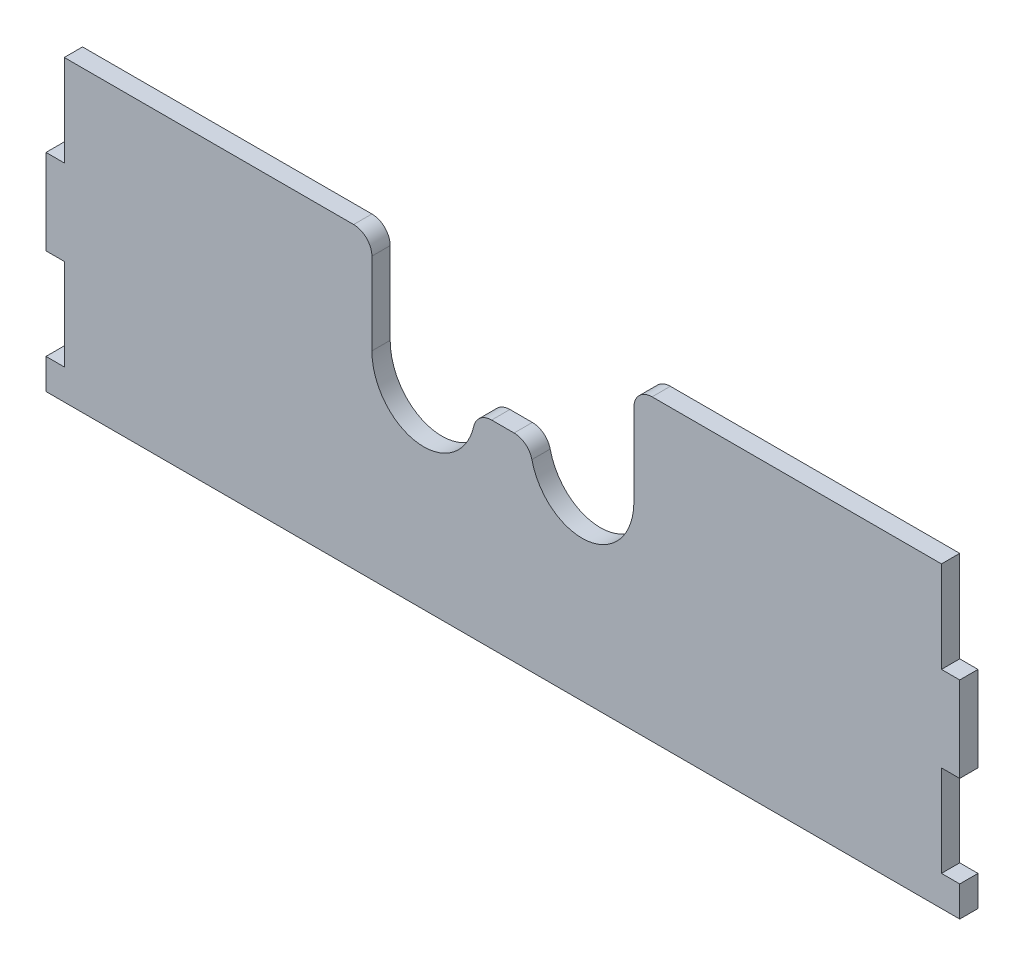
ISO-10303-21;
HEADER;
FILE_DESCRIPTION(('STEP AP214'),'2;1');
FILE_NAME('part.step','',(''),(''),'','','');
FILE_SCHEMA(('AUTOMOTIVE_DESIGN { 1 0 10303 214 1 1 1 1 }'));
ENDSEC;
DATA;
#1=APPLICATION_CONTEXT('core data for automotive mechanical design processes');
#2=APPLICATION_PROTOCOL_DEFINITION('international standard','automotive_design',2000,#1);
#3=PRODUCT_CONTEXT('',#1,'mechanical');
#4=PRODUCT('Part','Part','',(#3));
#5=PRODUCT_RELATED_PRODUCT_CATEGORY('part','',(#4));
#6=PRODUCT_DEFINITION_FORMATION('','',#4);
#7=PRODUCT_DEFINITION_CONTEXT('part definition',#1,'design');
#8=PRODUCT_DEFINITION('design','',#6,#7);
#9=PRODUCT_DEFINITION_SHAPE('','',#8);
#10=(LENGTH_UNIT() NAMED_UNIT(*) SI_UNIT(.MILLI.,.METRE.));
#11=(NAMED_UNIT(*) PLANE_ANGLE_UNIT() SI_UNIT($,.RADIAN.));
#12=(NAMED_UNIT(*) SI_UNIT($,.STERADIAN.) SOLID_ANGLE_UNIT());
#13=UNCERTAINTY_MEASURE_WITH_UNIT(LENGTH_MEASURE(1.E-05),#10,'distance_accuracy_value','');
#14=(GEOMETRIC_REPRESENTATION_CONTEXT(3) GLOBAL_UNCERTAINTY_ASSIGNED_CONTEXT((#13)) GLOBAL_UNIT_ASSIGNED_CONTEXT((#10,
#11,#12)) REPRESENTATION_CONTEXT('',''));
#15=CARTESIAN_POINT('',(0.,0.,0.));
#16=DIRECTION('',(0.,0.,1.));
#17=DIRECTION('',(1.,0.,0.));
#18=AXIS2_PLACEMENT_3D('',#15,#16,#17);
#19=CARTESIAN_POINT('',(0.,0.,3.));
#20=DIRECTION('',(0.,0.,1.));
#21=DIRECTION('',(1.,0.,0.));
#22=AXIS2_PLACEMENT_3D('',#19,#20,#21);
#23=PLANE('',#22);
#24=DIRECTION('',(0.,1.,0.));
#25=VECTOR('',#24,1.);
#26=CARTESIAN_POINT('',(-75.,0.,3.));
#27=LINE('',#26,#25);
#28=CARTESIAN_POINT('',(-75.,-24.,3.));
#29=VERTEX_POINT('',#28);
#30=CARTESIAN_POINT('',(-75.,-19.,3.));
#31=VERTEX_POINT('',#30);
#32=EDGE_CURVE('E227',#29,#31,#27,.T.);
#33=ORIENTED_EDGE('',*,*,#32,.F.);
#34=DIRECTION('',(-1.,0.,0.));
#35=VECTOR('',#34,1.);
#36=CARTESIAN_POINT('',(-75.,-24.,3.));
#37=LINE('',#36,#35);
#38=CARTESIAN_POINT('',(75.,-24.,3.));
#39=VERTEX_POINT('',#38);
#40=EDGE_CURVE('E56',#39,#29,#37,.T.);
#41=ORIENTED_EDGE('',*,*,#40,.F.);
#42=DIRECTION('',(0.,1.,0.));
#43=VECTOR('',#42,1.);
#44=CARTESIAN_POINT('',(75.,0.,3.));
#45=LINE('',#44,#43);
#46=CARTESIAN_POINT('',(75.,-19.,3.));
#47=VERTEX_POINT('',#46);
#48=EDGE_CURVE('E224',#39,#47,#45,.T.);
#49=ORIENTED_EDGE('',*,*,#48,.T.);
#50=DIRECTION('',(-1.,0.,0.));
#51=VECTOR('',#50,1.);
#52=CARTESIAN_POINT('',(0.,-19.,3.));
#53=LINE('',#52,#51);
#54=CARTESIAN_POINT('',(72.,-19.,3.));
#55=VERTEX_POINT('',#54);
#56=EDGE_CURVE('E233',#47,#55,#53,.T.);
#57=ORIENTED_EDGE('',*,*,#56,.T.);
#58=DIRECTION('',(0.,1.,0.));
#59=VECTOR('',#58,1.);
#60=CARTESIAN_POINT('',(72.,0.,3.));
#61=LINE('',#60,#59);
#62=CARTESIAN_POINT('',(72.,-4.,3.));
#63=VERTEX_POINT('',#62);
#64=EDGE_CURVE('E237',#55,#63,#61,.T.);
#65=ORIENTED_EDGE('',*,*,#64,.T.);
#66=DIRECTION('',(-1.,0.,0.));
#67=VECTOR('',#66,1.);
#68=CARTESIAN_POINT('',(0.,-3.99999999999996,3.));
#69=LINE('',#68,#67);
#70=CARTESIAN_POINT('',(75.,-4.,3.));
#71=VERTEX_POINT('',#70);
#72=EDGE_CURVE('E244',#71,#63,#69,.T.);
#73=ORIENTED_EDGE('',*,*,#72,.F.);
#74=CARTESIAN_POINT('',(75.,10.,3.));
#75=VERTEX_POINT('',#74);
#76=EDGE_CURVE('E236',#71,#75,#45,.T.);
#77=ORIENTED_EDGE('',*,*,#76,.T.);
#78=DIRECTION('',(-1.,0.,0.));
#79=VECTOR('',#78,1.);
#80=CARTESIAN_POINT('',(0.,10.,3.));
#81=LINE('',#80,#79);
#82=CARTESIAN_POINT('',(72.,10.,3.));
#83=VERTEX_POINT('',#82);
#84=EDGE_CURVE('E243',#75,#83,#81,.T.);
#85=ORIENTED_EDGE('',*,*,#84,.T.);
#86=DIRECTION('',(0.,1.,0.));
#87=VECTOR('',#86,1.);
#88=CARTESIAN_POINT('',(72.,0.,3.));
#89=LINE('',#88,#87);
#90=CARTESIAN_POINT('',(72.,25.,3.));
#91=VERTEX_POINT('',#90);
#92=EDGE_CURVE('E248',#83,#91,#89,.T.);
#93=ORIENTED_EDGE('',*,*,#92,.T.);
#94=DIRECTION('',(1.,0.,0.));
#95=VECTOR('',#94,1.);
#96=CARTESIAN_POINT('',(0.,25.,3.));
#97=LINE('',#96,#95);
#98=CARTESIAN_POINT('',(24.5,25.,3.));
#99=VERTEX_POINT('',#98);
#100=EDGE_CURVE('E257',#99,#91,#97,.T.);
#101=ORIENTED_EDGE('',*,*,#100,.F.);
#102=CARTESIAN_POINT('',(24.5,22.,3.));
#103=DIRECTION('',(0.,0.,1.));
#104=DIRECTION('',(1.,0.,0.));
#105=AXIS2_PLACEMENT_3D('',#102,#103,#104);
#106=CIRCLE('',#105,3.);
#107=CARTESIAN_POINT('',(21.5,22.,3.));
#108=VERTEX_POINT('',#107);
#109=EDGE_CURVE('E364',#99,#108,#106,.T.);
#110=ORIENTED_EDGE('',*,*,#109,.T.);
#111=DIRECTION('',(0.,1.,0.));
#112=VECTOR('',#111,1.);
#113=CARTESIAN_POINT('',(21.5,25.,3.));
#114=LINE('',#113,#112);
#115=CARTESIAN_POINT('',(21.5,8.53147829619743,3.));
#116=VERTEX_POINT('',#115);
#117=EDGE_CURVE('E400',#116,#108,#114,.T.);
#118=ORIENTED_EDGE('',*,*,#117,.F.);
#119=CARTESIAN_POINT('',(13.,8.53147829619743,3.));
#120=DIRECTION('',(0.,0.,1.));
#121=DIRECTION('',(0.,1.,0.));
#122=AXIS2_PLACEMENT_3D('',#119,#120,#121);
#123=ELLIPSE('',#122,9.37871231118118,8.5);
#124=CARTESIAN_POINT('',(4.76483275541187,6.20860689794301,3.));
#125=VERTEX_POINT('',#124);
#126=EDGE_CURVE('E281',#116,#125,#123,.F.);
#127=ORIENTED_EDGE('',*,*,#126,.T.);
#128=CARTESIAN_POINT('',(1.84224882048407,5.53147829619743,3.));
#129=DIRECTION('',(0.,0.,1.));
#130=DIRECTION('',(1.,0.,0.));
#131=AXIS2_PLACEMENT_3D('',#128,#129,#130);
#132=CIRCLE('',#131,3.);
#133=CARTESIAN_POINT('',(1.84224882048407,8.53147829619743,3.));
#134=VERTEX_POINT('',#133);
#135=EDGE_CURVE('E64',#125,#134,#132,.T.);
#136=ORIENTED_EDGE('',*,*,#135,.T.);
#137=DIRECTION('',(1.,0.,0.));
#138=VECTOR('',#137,1.);
#139=CARTESIAN_POINT('',(-21.5,8.53147829619743,3.));
#140=LINE('',#139,#138);
#141=CARTESIAN_POINT('',(-1.84224882048407,8.53147829619743,3.));
#142=VERTEX_POINT('',#141);
#143=EDGE_CURVE('E382',#142,#134,#140,.T.);
#144=ORIENTED_EDGE('',*,*,#143,.F.);
#145=CARTESIAN_POINT('',(-1.84224882048407,5.53147829619744,3.));
#146=DIRECTION('',(0.,0.,1.));
#147=DIRECTION('',(1.,0.,0.));
#148=AXIS2_PLACEMENT_3D('',#145,#146,#147);
#149=CIRCLE('',#148,3.);
#150=CARTESIAN_POINT('',(-4.76483275541187,6.20860689794302,3.));
#151=VERTEX_POINT('',#150);
#152=EDGE_CURVE('E359',#142,#151,#149,.T.);
#153=ORIENTED_EDGE('',*,*,#152,.T.);
#154=CARTESIAN_POINT('',(-13.,8.53147829619743,3.));
#155=DIRECTION('',(0.,0.,1.));
#156=DIRECTION('',(0.,1.,0.));
#157=AXIS2_PLACEMENT_3D('',#154,#155,#156);
#158=ELLIPSE('',#157,9.37871231118118,8.5);
#159=CARTESIAN_POINT('',(-21.5,8.53147829619743,3.));
#160=VERTEX_POINT('',#159);
#161=EDGE_CURVE('E401',#151,#160,#158,.F.);
#162=ORIENTED_EDGE('',*,*,#161,.T.);
#163=DIRECTION('',(0.,-1.,0.));
#164=VECTOR('',#163,1.);
#165=CARTESIAN_POINT('',(-21.5,25.,3.));
#166=LINE('',#165,#164);
#167=CARTESIAN_POINT('',(-21.5,22.,3.));
#168=VERTEX_POINT('',#167);
#169=EDGE_CURVE('E508',#168,#160,#166,.T.);
#170=ORIENTED_EDGE('',*,*,#169,.F.);
#171=CARTESIAN_POINT('',(-24.5,22.,3.));
#172=DIRECTION('',(0.,0.,1.));
#173=DIRECTION('',(1.,0.,0.));
#174=AXIS2_PLACEMENT_3D('',#171,#172,#173);
#175=CIRCLE('',#174,3.);
#176=CARTESIAN_POINT('',(-24.5,25.,3.));
#177=VERTEX_POINT('',#176);
#178=EDGE_CURVE('E362',#168,#177,#175,.T.);
#179=ORIENTED_EDGE('',*,*,#178,.T.);
#180=CARTESIAN_POINT('',(-72.,25.,3.));
#181=VERTEX_POINT('',#180);
#182=EDGE_CURVE('E258',#181,#177,#97,.T.);
#183=ORIENTED_EDGE('',*,*,#182,.F.);
#184=DIRECTION('',(0.,1.,0.));
#185=VECTOR('',#184,1.);
#186=CARTESIAN_POINT('',(-72.,0.,3.));
#187=LINE('',#186,#185);
#188=CARTESIAN_POINT('',(-72.,10.,3.));
#189=VERTEX_POINT('',#188);
#190=EDGE_CURVE('E261',#189,#181,#187,.T.);
#191=ORIENTED_EDGE('',*,*,#190,.F.);
#192=DIRECTION('',(1.,0.,0.));
#193=VECTOR('',#192,1.);
#194=CARTESIAN_POINT('',(0.,10.,3.));
#195=LINE('',#194,#193);
#196=CARTESIAN_POINT('',(-75.,10.,3.));
#197=VERTEX_POINT('',#196);
#198=EDGE_CURVE('E264',#197,#189,#195,.T.);
#199=ORIENTED_EDGE('',*,*,#198,.F.);
#200=CARTESIAN_POINT('',(-75.,-4.,3.));
#201=VERTEX_POINT('',#200);
#202=EDGE_CURVE('E267',#201,#197,#27,.T.);
#203=ORIENTED_EDGE('',*,*,#202,.F.);
#204=DIRECTION('',(1.,0.,0.));
#205=VECTOR('',#204,1.);
#206=CARTESIAN_POINT('',(0.,-3.99999999999996,3.));
#207=LINE('',#206,#205);
#208=CARTESIAN_POINT('',(-72.,-4.,3.));
#209=VERTEX_POINT('',#208);
#210=EDGE_CURVE('E270',#201,#209,#207,.T.);
#211=ORIENTED_EDGE('',*,*,#210,.T.);
#212=DIRECTION('',(0.,1.,0.));
#213=VECTOR('',#212,1.);
#214=CARTESIAN_POINT('',(-72.,0.,3.));
#215=LINE('',#214,#213);
#216=CARTESIAN_POINT('',(-72.,-19.,3.));
#217=VERTEX_POINT('',#216);
#218=EDGE_CURVE('E272',#217,#209,#215,.T.);
#219=ORIENTED_EDGE('',*,*,#218,.F.);
#220=DIRECTION('',(1.,0.,0.));
#221=VECTOR('',#220,1.);
#222=CARTESIAN_POINT('',(0.,-19.,3.));
#223=LINE('',#222,#221);
#224=EDGE_CURVE('E275',#31,#217,#223,.T.);
#225=ORIENTED_EDGE('',*,*,#224,.F.);
#226=EDGE_LOOP('',(#33,#41,#49,#57,#65,#73,#77,#85,#93,#101,#110,#118,#127,#136,#144,#153,#162,
#170,#179,#183,#191,#199,#203,#211,#219,#225));
#227=FACE_BOUND('',#226,.T.);
#228=ADVANCED_FACE('F41',(#227),#23,.T.);
#229=CARTESIAN_POINT('',(0.,0.,0.));
#230=DIRECTION('',(0.,0.,1.));
#231=DIRECTION('',(1.,0.,0.));
#232=AXIS2_PLACEMENT_3D('',#229,#230,#231);
#233=PLANE('',#232);
#234=DIRECTION('',(-1.,0.,0.));
#235=VECTOR('',#234,1.);
#236=CARTESIAN_POINT('',(-75.,-24.,0.));
#237=LINE('',#236,#235);
#238=CARTESIAN_POINT('',(75.,-24.,0.));
#239=VERTEX_POINT('',#238);
#240=CARTESIAN_POINT('',(-75.,-24.,0.));
#241=VERTEX_POINT('',#240);
#242=EDGE_CURVE('E216',#239,#241,#237,.T.);
#243=ORIENTED_EDGE('',*,*,#242,.T.);
#244=DIRECTION('',(0.,1.,0.));
#245=VECTOR('',#244,1.);
#246=CARTESIAN_POINT('',(-75.,0.,0.));
#247=LINE('',#246,#245);
#248=CARTESIAN_POINT('',(-75.,-19.,0.));
#249=VERTEX_POINT('',#248);
#250=EDGE_CURVE('E234',#241,#249,#247,.T.);
#251=ORIENTED_EDGE('',*,*,#250,.T.);
#252=DIRECTION('',(1.,0.,0.));
#253=VECTOR('',#252,1.);
#254=CARTESIAN_POINT('',(0.,-19.,0.));
#255=LINE('',#254,#253);
#256=CARTESIAN_POINT('',(-72.,-19.,0.));
#257=VERTEX_POINT('',#256);
#258=EDGE_CURVE('E239',#249,#257,#255,.T.);
#259=ORIENTED_EDGE('',*,*,#258,.T.);
#260=DIRECTION('',(0.,1.,0.));
#261=VECTOR('',#260,1.);
#262=CARTESIAN_POINT('',(-72.,0.,0.));
#263=LINE('',#262,#261);
#264=CARTESIAN_POINT('',(-72.,-4.,0.));
#265=VERTEX_POINT('',#264);
#266=EDGE_CURVE('E309',#257,#265,#263,.T.);
#267=ORIENTED_EDGE('',*,*,#266,.T.);
#268=DIRECTION('',(1.,0.,0.));
#269=VECTOR('',#268,1.);
#270=CARTESIAN_POINT('',(0.,-3.99999999999996,0.));
#271=LINE('',#270,#269);
#272=CARTESIAN_POINT('',(-75.,-4.,0.));
#273=VERTEX_POINT('',#272);
#274=EDGE_CURVE('E306',#273,#265,#271,.T.);
#275=ORIENTED_EDGE('',*,*,#274,.F.);
#276=CARTESIAN_POINT('',(-75.,10.,0.));
#277=VERTEX_POINT('',#276);
#278=EDGE_CURVE('E241',#273,#277,#247,.T.);
#279=ORIENTED_EDGE('',*,*,#278,.T.);
#280=DIRECTION('',(1.,0.,0.));
#281=VECTOR('',#280,1.);
#282=CARTESIAN_POINT('',(0.,10.,0.));
#283=LINE('',#282,#281);
#284=CARTESIAN_POINT('',(-72.,10.,0.));
#285=VERTEX_POINT('',#284);
#286=EDGE_CURVE('E302',#277,#285,#283,.T.);
#287=ORIENTED_EDGE('',*,*,#286,.T.);
#288=DIRECTION('',(0.,1.,0.));
#289=VECTOR('',#288,1.);
#290=CARTESIAN_POINT('',(-72.,0.,0.));
#291=LINE('',#290,#289);
#292=CARTESIAN_POINT('',(-72.,25.,0.));
#293=VERTEX_POINT('',#292);
#294=EDGE_CURVE('E299',#285,#293,#291,.T.);
#295=ORIENTED_EDGE('',*,*,#294,.T.);
#296=DIRECTION('',(1.,0.,0.));
#297=VECTOR('',#296,1.);
#298=CARTESIAN_POINT('',(0.,25.,0.));
#299=LINE('',#298,#297);
#300=CARTESIAN_POINT('',(-24.5,25.,0.));
#301=VERTEX_POINT('',#300);
#302=EDGE_CURVE('E296',#293,#301,#299,.T.);
#303=ORIENTED_EDGE('',*,*,#302,.T.);
#304=CARTESIAN_POINT('',(-24.5,22.,0.));
#305=DIRECTION('',(0.,0.,1.));
#306=DIRECTION('',(1.,0.,0.));
#307=AXIS2_PLACEMENT_3D('',#304,#305,#306);
#308=CIRCLE('',#307,3.);
#309=CARTESIAN_POINT('',(-21.5,22.,0.));
#310=VERTEX_POINT('',#309);
#311=EDGE_CURVE('E353',#301,#310,#308,.F.);
#312=ORIENTED_EDGE('',*,*,#311,.T.);
#313=DIRECTION('',(0.,-1.,0.));
#314=VECTOR('',#313,1.);
#315=CARTESIAN_POINT('',(-21.5,25.,0.));
#316=LINE('',#315,#314);
#317=CARTESIAN_POINT('',(-21.5,8.53147829619743,0.));
#318=VERTEX_POINT('',#317);
#319=EDGE_CURVE('E220',#310,#318,#316,.T.);
#320=ORIENTED_EDGE('',*,*,#319,.T.);
#321=CARTESIAN_POINT('',(-13.,8.53147829619743,0.));
#322=DIRECTION('',(0.,0.,1.));
#323=DIRECTION('',(0.,1.,0.));
#324=AXIS2_PLACEMENT_3D('',#321,#322,#323);
#325=ELLIPSE('',#324,9.37871231118118,8.5);
#326=CARTESIAN_POINT('',(-4.76483275541187,6.20860689794302,0.));
#327=VERTEX_POINT('',#326);
#328=EDGE_CURVE('E405',#318,#327,#325,.T.);
#329=ORIENTED_EDGE('',*,*,#328,.T.);
#330=CARTESIAN_POINT('',(-1.84224882048407,5.53147829619744,0.));
#331=DIRECTION('',(0.,0.,1.));
#332=DIRECTION('',(1.,0.,0.));
#333=AXIS2_PLACEMENT_3D('',#330,#331,#332);
#334=CIRCLE('',#333,3.);
#335=CARTESIAN_POINT('',(-1.84224882048407,8.53147829619743,0.));
#336=VERTEX_POINT('',#335);
#337=EDGE_CURVE('E349',#327,#336,#334,.F.);
#338=ORIENTED_EDGE('',*,*,#337,.T.);
#339=DIRECTION('',(1.,0.,0.));
#340=VECTOR('',#339,1.);
#341=CARTESIAN_POINT('',(-21.5,8.53147829619743,0.));
#342=LINE('',#341,#340);
#343=CARTESIAN_POINT('',(1.84224882048407,8.53147829619743,0.));
#344=VERTEX_POINT('',#343);
#345=EDGE_CURVE('E380',#336,#344,#342,.T.);
#346=ORIENTED_EDGE('',*,*,#345,.T.);
#347=CARTESIAN_POINT('',(1.84224882048407,5.53147829619743,0.));
#348=DIRECTION('',(0.,0.,1.));
#349=DIRECTION('',(1.,0.,0.));
#350=AXIS2_PLACEMENT_3D('',#347,#348,#349);
#351=CIRCLE('',#350,3.);
#352=CARTESIAN_POINT('',(4.76483275541187,6.20860689794301,0.));
#353=VERTEX_POINT('',#352);
#354=EDGE_CURVE('E351',#344,#353,#351,.F.);
#355=ORIENTED_EDGE('',*,*,#354,.T.);
#356=CARTESIAN_POINT('',(13.,8.53147829619743,0.));
#357=DIRECTION('',(0.,0.,1.));
#358=DIRECTION('',(0.,1.,0.));
#359=AXIS2_PLACEMENT_3D('',#356,#357,#358);
#360=ELLIPSE('',#359,9.37871231118118,8.5);
#361=CARTESIAN_POINT('',(21.5,8.53147829619743,0.));
#362=VERTEX_POINT('',#361);
#363=EDGE_CURVE('E397',#353,#362,#360,.T.);
#364=ORIENTED_EDGE('',*,*,#363,.T.);
#365=DIRECTION('',(0.,1.,0.));
#366=VECTOR('',#365,1.);
#367=CARTESIAN_POINT('',(21.5,25.,0.));
#368=LINE('',#367,#366);
#369=CARTESIAN_POINT('',(21.5,22.,0.));
#370=VERTEX_POINT('',#369);
#371=EDGE_CURVE('E389',#362,#370,#368,.T.);
#372=ORIENTED_EDGE('',*,*,#371,.T.);
#373=CARTESIAN_POINT('',(24.5,22.,0.));
#374=DIRECTION('',(0.,0.,1.));
#375=DIRECTION('',(1.,0.,0.));
#376=AXIS2_PLACEMENT_3D('',#373,#374,#375);
#377=CIRCLE('',#376,3.);
#378=CARTESIAN_POINT('',(24.5,25.,0.));
#379=VERTEX_POINT('',#378);
#380=EDGE_CURVE('E355',#370,#379,#377,.F.);
#381=ORIENTED_EDGE('',*,*,#380,.T.);
#382=CARTESIAN_POINT('',(72.,25.,0.));
#383=VERTEX_POINT('',#382);
#384=EDGE_CURVE('E295',#379,#383,#299,.T.);
#385=ORIENTED_EDGE('',*,*,#384,.T.);
#386=DIRECTION('',(0.,1.,0.));
#387=VECTOR('',#386,1.);
#388=CARTESIAN_POINT('',(72.,0.,0.));
#389=LINE('',#388,#387);
#390=CARTESIAN_POINT('',(72.,10.,0.));
#391=VERTEX_POINT('',#390);
#392=EDGE_CURVE('E292',#391,#383,#389,.T.);
#393=ORIENTED_EDGE('',*,*,#392,.F.);
#394=DIRECTION('',(-1.,0.,0.));
#395=VECTOR('',#394,1.);
#396=CARTESIAN_POINT('',(0.,10.,0.));
#397=LINE('',#396,#395);
#398=CARTESIAN_POINT('',(75.,10.,0.));
#399=VERTEX_POINT('',#398);
#400=EDGE_CURVE('E290',#399,#391,#397,.T.);
#401=ORIENTED_EDGE('',*,*,#400,.F.);
#402=DIRECTION('',(0.,1.,0.));
#403=VECTOR('',#402,1.);
#404=CARTESIAN_POINT('',(75.,0.,0.));
#405=LINE('',#404,#403);
#406=CARTESIAN_POINT('',(75.,-4.,0.));
#407=VERTEX_POINT('',#406);
#408=EDGE_CURVE('E282',#407,#399,#405,.T.);
#409=ORIENTED_EDGE('',*,*,#408,.F.);
#410=DIRECTION('',(-1.,0.,0.));
#411=VECTOR('',#410,1.);
#412=CARTESIAN_POINT('',(0.,-3.99999999999996,0.));
#413=LINE('',#412,#411);
#414=CARTESIAN_POINT('',(72.,-4.,0.));
#415=VERTEX_POINT('',#414);
#416=EDGE_CURVE('E287',#407,#415,#413,.T.);
#417=ORIENTED_EDGE('',*,*,#416,.T.);
#418=DIRECTION('',(0.,1.,0.));
#419=VECTOR('',#418,1.);
#420=CARTESIAN_POINT('',(72.,0.,0.));
#421=LINE('',#420,#419);
#422=CARTESIAN_POINT('',(72.,-19.,0.));
#423=VERTEX_POINT('',#422);
#424=EDGE_CURVE('E284',#423,#415,#421,.T.);
#425=ORIENTED_EDGE('',*,*,#424,.F.);
#426=DIRECTION('',(-1.,0.,0.));
#427=VECTOR('',#426,1.);
#428=CARTESIAN_POINT('',(0.,-19.,0.));
#429=LINE('',#428,#427);
#430=CARTESIAN_POINT('',(75.,-19.,0.));
#431=VERTEX_POINT('',#430);
#432=EDGE_CURVE('E280',#431,#423,#429,.T.);
#433=ORIENTED_EDGE('',*,*,#432,.F.);
#434=EDGE_CURVE('E278',#239,#431,#405,.T.);
#435=ORIENTED_EDGE('',*,*,#434,.F.);
#436=EDGE_LOOP('',(#243,#251,#259,#267,#275,#279,#287,#295,#303,#312,#320,#329,#338,#346,#355,
#364,#372,#381,#385,#393,#401,#409,#417,#425,#433,#435));
#437=FACE_BOUND('',#436,.T.);
#438=ADVANCED_FACE('F386',(#437),#233,.F.);
#439=CARTESIAN_POINT('',(75.,0.,3.));
#440=DIRECTION('',(-1.,0.,0.));
#441=DIRECTION('',(0.,0.,1.));
#442=AXIS2_PLACEMENT_3D('',#439,#440,#441);
#443=PLANE('',#442);
#444=DIRECTION('',(0.,0.,-1.));
#445=VECTOR('',#444,1.);
#446=CARTESIAN_POINT('',(75.,-24.,3.));
#447=LINE('',#446,#445);
#448=EDGE_CURVE('E213',#39,#239,#447,.T.);
#449=ORIENTED_EDGE('',*,*,#448,.T.);
#450=ORIENTED_EDGE('',*,*,#434,.T.);
#451=DIRECTION('',(0.,0.,-1.));
#452=VECTOR('',#451,1.);
#453=CARTESIAN_POINT('',(75.,-19.,3.));
#454=LINE('',#453,#452);
#455=EDGE_CURVE('E232',#47,#431,#454,.T.);
#456=ORIENTED_EDGE('',*,*,#455,.F.);
#457=ORIENTED_EDGE('',*,*,#48,.F.);
#458=EDGE_LOOP('',(#449,#450,#456,#457));
#459=FACE_BOUND('',#458,.T.);
#460=ADVANCED_FACE('F230',(#459),#443,.F.);
#461=CARTESIAN_POINT('',(-75.,0.,3.));
#462=DIRECTION('',(-1.,0.,0.));
#463=DIRECTION('',(0.,0.,1.));
#464=AXIS2_PLACEMENT_3D('',#461,#462,#463);
#465=PLANE('',#464);
#466=ORIENTED_EDGE('',*,*,#250,.F.);
#467=DIRECTION('',(0.,0.,-1.));
#468=VECTOR('',#467,1.);
#469=CARTESIAN_POINT('',(-75.,-24.,3.));
#470=LINE('',#469,#468);
#471=EDGE_CURVE('E221',#29,#241,#470,.T.);
#472=ORIENTED_EDGE('',*,*,#471,.F.);
#473=ORIENTED_EDGE('',*,*,#32,.T.);
#474=DIRECTION('',(0.,0.,-1.));
#475=VECTOR('',#474,1.);
#476=CARTESIAN_POINT('',(-75.,-19.,3.));
#477=LINE('',#476,#475);
#478=EDGE_CURVE('E314',#31,#249,#477,.T.);
#479=ORIENTED_EDGE('',*,*,#478,.T.);
#480=EDGE_LOOP('',(#466,#472,#473,#479));
#481=FACE_BOUND('',#480,.T.);
#482=ADVANCED_FACE('F423',(#481),#465,.T.);
#483=CARTESIAN_POINT('',(0.,25.,3.));
#484=DIRECTION('',(0.,1.,0.));
#485=DIRECTION('',(0.,0.,1.));
#486=AXIS2_PLACEMENT_3D('',#483,#484,#485);
#487=PLANE('',#486);
#488=ORIENTED_EDGE('',*,*,#182,.T.);
#489=DIRECTION('',(0.,0.,-1.));
#490=VECTOR('',#489,1.);
#491=CARTESIAN_POINT('',(-24.5,25.,3.));
#492=LINE('',#491,#490);
#493=EDGE_CURVE('E366',#177,#301,#492,.T.);
#494=ORIENTED_EDGE('',*,*,#493,.T.);
#495=ORIENTED_EDGE('',*,*,#302,.F.);
#496=DIRECTION('',(0.,0.,-1.));
#497=VECTOR('',#496,1.);
#498=CARTESIAN_POINT('',(-72.,25.,3.));
#499=LINE('',#498,#497);
#500=EDGE_CURVE('E327',#181,#293,#499,.T.);
#501=ORIENTED_EDGE('',*,*,#500,.F.);
#502=EDGE_LOOP('',(#488,#494,#495,#501));
#503=FACE_BOUND('',#502,.T.);
#504=ADVANCED_FACE('F426',(#503),#487,.T.);
#505=ORIENTED_EDGE('',*,*,#384,.F.);
#506=DIRECTION('',(0.,0.,-1.));
#507=VECTOR('',#506,1.);
#508=CARTESIAN_POINT('',(24.5,25.,3.));
#509=LINE('',#508,#507);
#510=EDGE_CURVE('E357',#379,#99,#509,.F.);
#511=ORIENTED_EDGE('',*,*,#510,.T.);
#512=ORIENTED_EDGE('',*,*,#100,.T.);
#513=DIRECTION('',(0.,0.,-1.));
#514=VECTOR('',#513,1.);
#515=CARTESIAN_POINT('',(72.,25.,3.));
#516=LINE('',#515,#514);
#517=EDGE_CURVE('E329',#91,#383,#516,.T.);
#518=ORIENTED_EDGE('',*,*,#517,.T.);
#519=EDGE_LOOP('',(#505,#511,#512,#518));
#520=FACE_BOUND('',#519,.T.);
#521=ADVANCED_FACE('F452',(#520),#487,.T.);
#522=CARTESIAN_POINT('',(13.,8.53147829619743,3.));
#523=DIRECTION('',(0.,0.,1.));
#524=DIRECTION('',(0.,1.,0.));
#525=AXIS2_PLACEMENT_3D('',#522,#523,#524);
#526=ELLIPSE('',#525,9.37871231118118,8.5);
#527=DIRECTION('',(0.,0.,-1.));
#528=VECTOR('',#527,1.);
#529=SURFACE_OF_LINEAR_EXTRUSION('',#526,#528);
#530=ORIENTED_EDGE('',*,*,#363,.F.);
#531=DIRECTION('',(0.,0.,-1.));
#532=VECTOR('',#531,1.);
#533=CARTESIAN_POINT('',(4.76483275541187,6.20860689794301,0.));
#534=LINE('',#533,#532);
#535=EDGE_CURVE('E371',#353,#125,#534,.F.);
#536=ORIENTED_EDGE('',*,*,#535,.T.);
#537=ORIENTED_EDGE('',*,*,#126,.F.);
#538=DIRECTION('',(0.,0.,-1.));
#539=VECTOR('',#538,1.);
#540=CARTESIAN_POINT('',(21.5,8.53147829619743,3.));
#541=LINE('',#540,#539);
#542=EDGE_CURVE('E502',#116,#362,#541,.T.);
#543=ORIENTED_EDGE('',*,*,#542,.T.);
#544=EDGE_LOOP('',(#530,#536,#537,#543));
#545=FACE_BOUND('',#544,.T.);
#546=ADVANCED_FACE('F395',(#545),#529,.T.);
#547=CARTESIAN_POINT('',(-13.,8.53147829619743,3.));
#548=DIRECTION('',(0.,0.,1.));
#549=DIRECTION('',(0.,1.,0.));
#550=AXIS2_PLACEMENT_3D('',#547,#548,#549);
#551=ELLIPSE('',#550,9.37871231118118,8.5);
#552=DIRECTION('',(0.,0.,-1.));
#553=VECTOR('',#552,1.);
#554=SURFACE_OF_LINEAR_EXTRUSION('',#551,#553);
#555=ORIENTED_EDGE('',*,*,#161,.F.);
#556=DIRECTION('',(0.,0.,-1.));
#557=VECTOR('',#556,1.);
#558=CARTESIAN_POINT('',(-4.76483275541187,6.20860689794302,3.));
#559=LINE('',#558,#557);
#560=EDGE_CURVE('E11',#151,#327,#559,.T.);
#561=ORIENTED_EDGE('',*,*,#560,.T.);
#562=ORIENTED_EDGE('',*,*,#328,.F.);
#563=DIRECTION('',(0.,0.,-1.));
#564=VECTOR('',#563,1.);
#565=CARTESIAN_POINT('',(-21.5,8.53147829619743,3.));
#566=LINE('',#565,#564);
#567=EDGE_CURVE('E407',#160,#318,#566,.T.);
#568=ORIENTED_EDGE('',*,*,#567,.F.);
#569=EDGE_LOOP('',(#555,#561,#562,#568));
#570=FACE_BOUND('',#569,.T.);
#571=ADVANCED_FACE('F412',(#570),#554,.T.);
#572=CARTESIAN_POINT('',(0.,-19.,3.));
#573=DIRECTION('',(0.,-1.,0.));
#574=DIRECTION('',(0.,0.,-1.));
#575=AXIS2_PLACEMENT_3D('',#572,#573,#574);
#576=PLANE('',#575);
#577=ORIENTED_EDGE('',*,*,#432,.T.);
#578=DIRECTION('',(0.,0.,-1.));
#579=VECTOR('',#578,1.);
#580=CARTESIAN_POINT('',(72.,-19.,3.));
#581=LINE('',#580,#579);
#582=EDGE_CURVE('E342',#55,#423,#581,.T.);
#583=ORIENTED_EDGE('',*,*,#582,.F.);
#584=ORIENTED_EDGE('',*,*,#56,.F.);
#585=ORIENTED_EDGE('',*,*,#455,.T.);
#586=EDGE_LOOP('',(#577,#583,#584,#585));
#587=FACE_BOUND('',#586,.T.);
#588=ADVANCED_FACE('F416',(#587),#576,.F.);
#589=CARTESIAN_POINT('',(72.,0.,3.));
#590=DIRECTION('',(-1.,0.,0.));
#591=DIRECTION('',(0.,0.,1.));
#592=AXIS2_PLACEMENT_3D('',#589,#590,#591);
#593=PLANE('',#592);
#594=ORIENTED_EDGE('',*,*,#424,.T.);
#595=DIRECTION('',(0.,0.,-1.));
#596=VECTOR('',#595,1.);
#597=CARTESIAN_POINT('',(72.,-4.,3.));
#598=LINE('',#597,#596);
#599=EDGE_CURVE('E340',#63,#415,#598,.T.);
#600=ORIENTED_EDGE('',*,*,#599,.F.);
#601=ORIENTED_EDGE('',*,*,#64,.F.);
#602=ORIENTED_EDGE('',*,*,#582,.T.);
#603=EDGE_LOOP('',(#594,#600,#601,#602));
#604=FACE_BOUND('',#603,.T.);
#605=ADVANCED_FACE('F468',(#604),#593,.F.);
#606=CARTESIAN_POINT('',(0.,-3.99999999999996,3.));
#607=DIRECTION('',(0.,-1.,0.));
#608=DIRECTION('',(1.,0.,0.));
#609=AXIS2_PLACEMENT_3D('',#606,#607,#608);
#610=PLANE('',#609);
#611=ORIENTED_EDGE('',*,*,#416,.F.);
#612=DIRECTION('',(0.,0.,-1.));
#613=VECTOR('',#612,1.);
#614=CARTESIAN_POINT('',(75.,-4.,3.));
#615=LINE('',#614,#613);
#616=EDGE_CURVE('E338',#71,#407,#615,.T.);
#617=ORIENTED_EDGE('',*,*,#616,.F.);
#618=ORIENTED_EDGE('',*,*,#72,.T.);
#619=ORIENTED_EDGE('',*,*,#599,.T.);
#620=EDGE_LOOP('',(#611,#617,#618,#619));
#621=FACE_BOUND('',#620,.T.);
#622=ADVANCED_FACE('F464',(#621),#610,.T.);
#623=ORIENTED_EDGE('',*,*,#408,.T.);
#624=DIRECTION('',(0.,0.,-1.));
#625=VECTOR('',#624,1.);
#626=CARTESIAN_POINT('',(75.,10.,3.));
#627=LINE('',#626,#625);
#628=EDGE_CURVE('E335',#75,#399,#627,.T.);
#629=ORIENTED_EDGE('',*,*,#628,.F.);
#630=ORIENTED_EDGE('',*,*,#76,.F.);
#631=ORIENTED_EDGE('',*,*,#616,.T.);
#632=EDGE_LOOP('',(#623,#629,#630,#631));
#633=FACE_BOUND('',#632,.T.);
#634=ADVANCED_FACE('F460',(#633),#443,.F.);
#635=CARTESIAN_POINT('',(0.,10.,3.));
#636=DIRECTION('',(0.,-1.,0.));
#637=DIRECTION('',(0.,0.,-1.));
#638=AXIS2_PLACEMENT_3D('',#635,#636,#637);
#639=PLANE('',#638);
#640=ORIENTED_EDGE('',*,*,#400,.T.);
#641=DIRECTION('',(0.,0.,-1.));
#642=VECTOR('',#641,1.);
#643=CARTESIAN_POINT('',(72.,10.,3.));
#644=LINE('',#643,#642);
#645=EDGE_CURVE('E332',#83,#391,#644,.T.);
#646=ORIENTED_EDGE('',*,*,#645,.F.);
#647=ORIENTED_EDGE('',*,*,#84,.F.);
#648=ORIENTED_EDGE('',*,*,#628,.T.);
#649=EDGE_LOOP('',(#640,#646,#647,#648));
#650=FACE_BOUND('',#649,.T.);
#651=ADVANCED_FACE('F456',(#650),#639,.F.);
#652=CARTESIAN_POINT('',(72.,0.,3.));
#653=DIRECTION('',(-1.,0.,0.));
#654=DIRECTION('',(0.,0.,1.));
#655=AXIS2_PLACEMENT_3D('',#652,#653,#654);
#656=PLANE('',#655);
#657=ORIENTED_EDGE('',*,*,#392,.T.);
#658=ORIENTED_EDGE('',*,*,#517,.F.);
#659=ORIENTED_EDGE('',*,*,#92,.F.);
#660=ORIENTED_EDGE('',*,*,#645,.T.);
#661=EDGE_LOOP('',(#657,#658,#659,#660));
#662=FACE_BOUND('',#661,.T.);
#663=ADVANCED_FACE('F448',(#662),#656,.F.);
#664=CARTESIAN_POINT('',(-72.,0.,3.));
#665=DIRECTION('',(-1.,0.,0.));
#666=DIRECTION('',(0.,0.,1.));
#667=AXIS2_PLACEMENT_3D('',#664,#665,#666);
#668=PLANE('',#667);
#669=ORIENTED_EDGE('',*,*,#294,.F.);
#670=DIRECTION('',(0.,0.,-1.));
#671=VECTOR('',#670,1.);
#672=CARTESIAN_POINT('',(-72.,10.,3.));
#673=LINE('',#672,#671);
#674=EDGE_CURVE('E325',#189,#285,#673,.T.);
#675=ORIENTED_EDGE('',*,*,#674,.F.);
#676=ORIENTED_EDGE('',*,*,#190,.T.);
#677=ORIENTED_EDGE('',*,*,#500,.T.);
#678=EDGE_LOOP('',(#669,#675,#676,#677));
#679=FACE_BOUND('',#678,.T.);
#680=ADVANCED_FACE('F444',(#679),#668,.T.);
#681=CARTESIAN_POINT('',(0.,10.,3.));
#682=DIRECTION('',(0.,1.,0.));
#683=DIRECTION('',(0.,0.,1.));
#684=AXIS2_PLACEMENT_3D('',#681,#682,#683);
#685=PLANE('',#684);
#686=ORIENTED_EDGE('',*,*,#286,.F.);
#687=DIRECTION('',(0.,0.,-1.));
#688=VECTOR('',#687,1.);
#689=CARTESIAN_POINT('',(-75.,10.,3.));
#690=LINE('',#689,#688);
#691=EDGE_CURVE('E323',#197,#277,#690,.T.);
#692=ORIENTED_EDGE('',*,*,#691,.F.);
#693=ORIENTED_EDGE('',*,*,#198,.T.);
#694=ORIENTED_EDGE('',*,*,#674,.T.);
#695=EDGE_LOOP('',(#686,#692,#693,#694));
#696=FACE_BOUND('',#695,.T.);
#697=ADVANCED_FACE('F441',(#696),#685,.T.);
#698=ORIENTED_EDGE('',*,*,#278,.F.);
#699=DIRECTION('',(0.,0.,-1.));
#700=VECTOR('',#699,1.);
#701=CARTESIAN_POINT('',(-75.,-4.,3.));
#702=LINE('',#701,#700);
#703=EDGE_CURVE('E321',#201,#273,#702,.T.);
#704=ORIENTED_EDGE('',*,*,#703,.F.);
#705=ORIENTED_EDGE('',*,*,#202,.T.);
#706=ORIENTED_EDGE('',*,*,#691,.T.);
#707=EDGE_LOOP('',(#698,#704,#705,#706));
#708=FACE_BOUND('',#707,.T.);
#709=ADVANCED_FACE('F428',(#708),#465,.T.);
#710=CARTESIAN_POINT('',(0.,-3.99999999999996,3.));
#711=DIRECTION('',(0.,1.,0.));
#712=DIRECTION('',(-1.,0.,0.));
#713=AXIS2_PLACEMENT_3D('',#710,#711,#712);
#714=PLANE('',#713);
#715=ORIENTED_EDGE('',*,*,#274,.T.);
#716=DIRECTION('',(0.,0.,-1.));
#717=VECTOR('',#716,1.);
#718=CARTESIAN_POINT('',(-72.,-4.,3.));
#719=LINE('',#718,#717);
#720=EDGE_CURVE('E319',#209,#265,#719,.T.);
#721=ORIENTED_EDGE('',*,*,#720,.F.);
#722=ORIENTED_EDGE('',*,*,#210,.F.);
#723=ORIENTED_EDGE('',*,*,#703,.T.);
#724=EDGE_LOOP('',(#715,#721,#722,#723));
#725=FACE_BOUND('',#724,.T.);
#726=ADVANCED_FACE('F436',(#725),#714,.F.);
#727=CARTESIAN_POINT('',(-72.,0.,3.));
#728=DIRECTION('',(-1.,0.,0.));
#729=DIRECTION('',(0.,0.,1.));
#730=AXIS2_PLACEMENT_3D('',#727,#728,#729);
#731=PLANE('',#730);
#732=ORIENTED_EDGE('',*,*,#266,.F.);
#733=DIRECTION('',(0.,0.,-1.));
#734=VECTOR('',#733,1.);
#735=CARTESIAN_POINT('',(-72.,-19.,3.));
#736=LINE('',#735,#734);
#737=EDGE_CURVE('E317',#217,#257,#736,.T.);
#738=ORIENTED_EDGE('',*,*,#737,.F.);
#739=ORIENTED_EDGE('',*,*,#218,.T.);
#740=ORIENTED_EDGE('',*,*,#720,.T.);
#741=EDGE_LOOP('',(#732,#738,#739,#740));
#742=FACE_BOUND('',#741,.T.);
#743=ADVANCED_FACE('F432',(#742),#731,.T.);
#744=CARTESIAN_POINT('',(0.,-19.,3.));
#745=DIRECTION('',(0.,1.,0.));
#746=DIRECTION('',(0.,0.,1.));
#747=AXIS2_PLACEMENT_3D('',#744,#745,#746);
#748=PLANE('',#747);
#749=ORIENTED_EDGE('',*,*,#258,.F.);
#750=ORIENTED_EDGE('',*,*,#478,.F.);
#751=ORIENTED_EDGE('',*,*,#224,.T.);
#752=ORIENTED_EDGE('',*,*,#737,.T.);
#753=EDGE_LOOP('',(#749,#750,#751,#752));
#754=FACE_BOUND('',#753,.T.);
#755=ADVANCED_FACE('F429',(#754),#748,.T.);
#756=CARTESIAN_POINT('',(-21.5,8.53147829619743,3.));
#757=DIRECTION('',(0.,1.,0.));
#758=DIRECTION('',(-1.,0.,0.));
#759=AXIS2_PLACEMENT_3D('',#756,#757,#758);
#760=PLANE('',#759);
#761=ORIENTED_EDGE('',*,*,#143,.T.);
#762=DIRECTION('',(0.,0.,-1.));
#763=VECTOR('',#762,1.);
#764=CARTESIAN_POINT('',(1.84224882048407,8.53147829619743,3.));
#765=LINE('',#764,#763);
#766=EDGE_CURVE('E49',#134,#344,#765,.T.);
#767=ORIENTED_EDGE('',*,*,#766,.T.);
#768=ORIENTED_EDGE('',*,*,#345,.F.);
#769=DIRECTION('',(0.,0.,-1.));
#770=VECTOR('',#769,1.);
#771=CARTESIAN_POINT('',(-1.84224882048407,8.53147829619743,3.));
#772=LINE('',#771,#770);
#773=EDGE_CURVE('E374',#336,#142,#772,.F.);
#774=ORIENTED_EDGE('',*,*,#773,.T.);
#775=EDGE_LOOP('',(#761,#767,#768,#774));
#776=FACE_BOUND('',#775,.T.);
#777=ADVANCED_FACE('F379',(#776),#760,.T.);
#778=CARTESIAN_POINT('',(-21.5,25.,3.));
#779=DIRECTION('',(1.,0.,0.));
#780=DIRECTION('',(0.,1.,0.));
#781=AXIS2_PLACEMENT_3D('',#778,#779,#780);
#782=PLANE('',#781);
#783=ORIENTED_EDGE('',*,*,#319,.F.);
#784=DIRECTION('',(0.,0.,-1.));
#785=VECTOR('',#784,1.);
#786=CARTESIAN_POINT('',(-21.5,22.,3.));
#787=LINE('',#786,#785);
#788=EDGE_CURVE('E369',#310,#168,#787,.F.);
#789=ORIENTED_EDGE('',*,*,#788,.T.);
#790=ORIENTED_EDGE('',*,*,#169,.T.);
#791=ORIENTED_EDGE('',*,*,#567,.T.);
#792=EDGE_LOOP('',(#783,#789,#790,#791));
#793=FACE_BOUND('',#792,.T.);
#794=ADVANCED_FACE('F535',(#793),#782,.T.);
#795=CARTESIAN_POINT('',(21.5,25.,3.));
#796=DIRECTION('',(-1.,0.,0.));
#797=DIRECTION('',(0.,-1.,0.));
#798=AXIS2_PLACEMENT_3D('',#795,#796,#797);
#799=PLANE('',#798);
#800=ORIENTED_EDGE('',*,*,#117,.T.);
#801=DIRECTION('',(0.,0.,-1.));
#802=VECTOR('',#801,1.);
#803=CARTESIAN_POINT('',(21.5,22.,3.));
#804=LINE('',#803,#802);
#805=EDGE_CURVE('E346',#108,#370,#804,.T.);
#806=ORIENTED_EDGE('',*,*,#805,.T.);
#807=ORIENTED_EDGE('',*,*,#371,.F.);
#808=ORIENTED_EDGE('',*,*,#542,.F.);
#809=EDGE_LOOP('',(#800,#806,#807,#808));
#810=FACE_BOUND('',#809,.T.);
#811=ADVANCED_FACE('F479',(#810),#799,.T.);
#812=CARTESIAN_POINT('',(24.5,22.,3.));
#813=DIRECTION('',(0.,0.,-1.));
#814=DIRECTION('',(-1.,0.,0.));
#815=AXIS2_PLACEMENT_3D('',#812,#813,#814);
#816=CYLINDRICAL_SURFACE('',#815,3.);
#817=ORIENTED_EDGE('',*,*,#109,.F.);
#818=ORIENTED_EDGE('',*,*,#510,.F.);
#819=ORIENTED_EDGE('',*,*,#380,.F.);
#820=ORIENTED_EDGE('',*,*,#805,.F.);
#821=EDGE_LOOP('',(#817,#818,#819,#820));
#822=FACE_BOUND('',#821,.T.);
#823=ADVANCED_FACE('F475',(#822),#816,.T.);
#824=CARTESIAN_POINT('',(-24.5,22.,3.));
#825=DIRECTION('',(0.,0.,-1.));
#826=DIRECTION('',(-1.,0.,0.));
#827=AXIS2_PLACEMENT_3D('',#824,#825,#826);
#828=CYLINDRICAL_SURFACE('',#827,3.);
#829=ORIENTED_EDGE('',*,*,#178,.F.);
#830=ORIENTED_EDGE('',*,*,#788,.F.);
#831=ORIENTED_EDGE('',*,*,#311,.F.);
#832=ORIENTED_EDGE('',*,*,#493,.F.);
#833=EDGE_LOOP('',(#829,#830,#831,#832));
#834=FACE_BOUND('',#833,.T.);
#835=ADVANCED_FACE('F478',(#834),#828,.T.);
#836=CARTESIAN_POINT('',(1.84224882048407,5.53147829619743,1.5));
#837=DIRECTION('',(0.,0.,-1.));
#838=DIRECTION('',(-1.,0.,0.));
#839=AXIS2_PLACEMENT_3D('',#836,#837,#838);
#840=CYLINDRICAL_SURFACE('',#839,3.);
#841=ORIENTED_EDGE('',*,*,#354,.F.);
#842=ORIENTED_EDGE('',*,*,#766,.F.);
#843=ORIENTED_EDGE('',*,*,#135,.F.);
#844=ORIENTED_EDGE('',*,*,#535,.F.);
#845=EDGE_LOOP('',(#841,#842,#843,#844));
#846=FACE_BOUND('',#845,.T.);
#847=ADVANCED_FACE('F392',(#846),#840,.T.);
#848=CARTESIAN_POINT('',(-1.84224882048407,5.53147829619744,1.5));
#849=DIRECTION('',(0.,0.,-1.));
#850=DIRECTION('',(-1.,0.,0.));
#851=AXIS2_PLACEMENT_3D('',#848,#849,#850);
#852=CYLINDRICAL_SURFACE('',#851,3.);
#853=ORIENTED_EDGE('',*,*,#152,.F.);
#854=ORIENTED_EDGE('',*,*,#773,.F.);
#855=ORIENTED_EDGE('',*,*,#337,.F.);
#856=ORIENTED_EDGE('',*,*,#560,.F.);
#857=EDGE_LOOP('',(#853,#854,#855,#856));
#858=FACE_BOUND('',#857,.T.);
#859=ADVANCED_FACE('F43',(#858),#852,.T.);
#860=CARTESIAN_POINT('',(-75.,-24.,3.));
#861=DIRECTION('',(0.,-1.,0.));
#862=DIRECTION('',(0.,0.,-1.));
#863=AXIS2_PLACEMENT_3D('',#860,#861,#862);
#864=PLANE('',#863);
#865=ORIENTED_EDGE('',*,*,#242,.F.);
#866=ORIENTED_EDGE('',*,*,#448,.F.);
#867=ORIENTED_EDGE('',*,*,#40,.T.);
#868=ORIENTED_EDGE('',*,*,#471,.T.);
#869=EDGE_LOOP('',(#865,#866,#867,#868));
#870=FACE_BOUND('',#869,.T.);
#871=ADVANCED_FACE('F214',(#870),#864,.T.);
#872=CLOSED_SHELL('',(#228,#438,#460,#482,#504,#521,#546,#571,#588,#605,#622,#634,#651,#663,
#680,#697,#709,#726,#743,#755,#777,#794,#811,#823,#835,#847,#859,#871));
#873=MANIFOLD_SOLID_BREP('B2',#872);
#874=ADVANCED_BREP_SHAPE_REPRESENTATION('',(#18,#873),#14);
#875=SHAPE_DEFINITION_REPRESENTATION(#9,#874);
ENDSEC;
END-ISO-10303-21;
